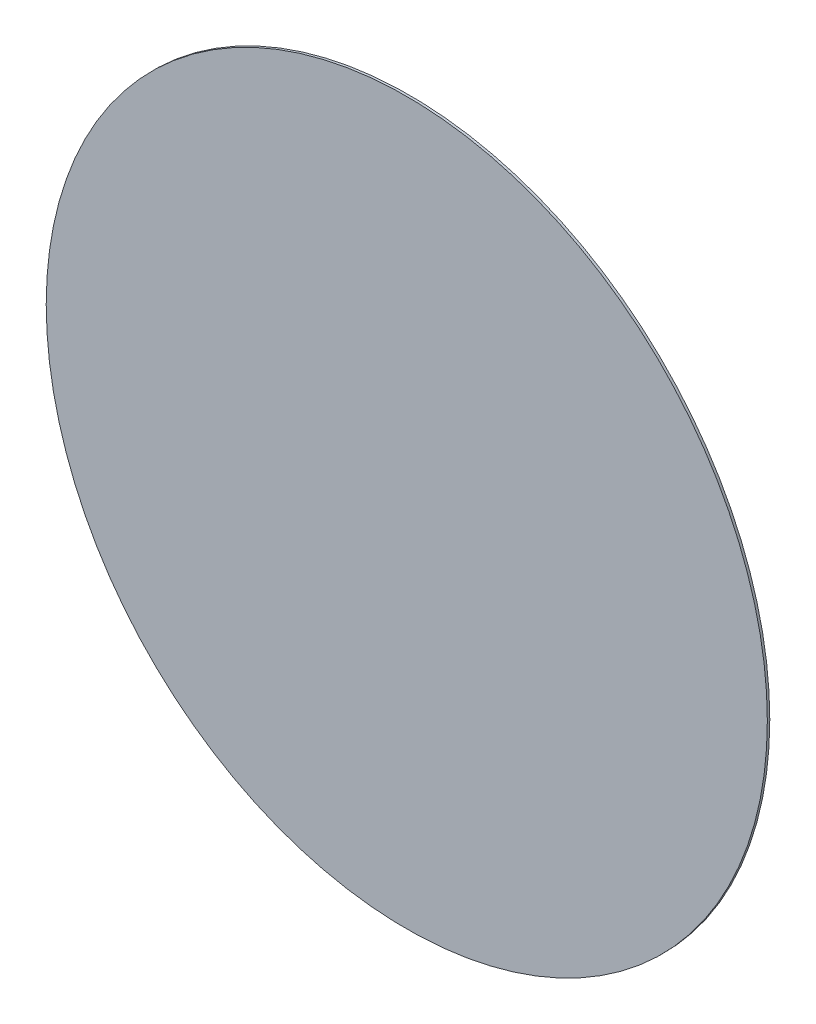
ISO-10303-21;
HEADER;
FILE_DESCRIPTION(('STEP AP214'),'2;1');
FILE_NAME('part.step','',(''),(''),'','','');
FILE_SCHEMA(('AUTOMOTIVE_DESIGN { 1 0 10303 214 1 1 1 1 }'));
ENDSEC;
DATA;
#1=APPLICATION_CONTEXT('core data for automotive mechanical design processes');
#2=APPLICATION_PROTOCOL_DEFINITION('international standard','automotive_design',2000,#1);
#3=PRODUCT_CONTEXT('',#1,'mechanical');
#4=PRODUCT('Part','Part','',(#3));
#5=PRODUCT_RELATED_PRODUCT_CATEGORY('part','',(#4));
#6=PRODUCT_DEFINITION_FORMATION('','',#4);
#7=PRODUCT_DEFINITION_CONTEXT('part definition',#1,'design');
#8=PRODUCT_DEFINITION('design','',#6,#7);
#9=PRODUCT_DEFINITION_SHAPE('','',#8);
#10=(LENGTH_UNIT() NAMED_UNIT(*) SI_UNIT(.MILLI.,.METRE.));
#11=(NAMED_UNIT(*) PLANE_ANGLE_UNIT() SI_UNIT($,.RADIAN.));
#12=(NAMED_UNIT(*) SI_UNIT($,.STERADIAN.) SOLID_ANGLE_UNIT());
#13=UNCERTAINTY_MEASURE_WITH_UNIT(LENGTH_MEASURE(1.E-05),#10,'distance_accuracy_value','');
#14=(GEOMETRIC_REPRESENTATION_CONTEXT(3) GLOBAL_UNCERTAINTY_ASSIGNED_CONTEXT((#13)) GLOBAL_UNIT_ASSIGNED_CONTEXT((#10,
#11,#12)) REPRESENTATION_CONTEXT('',''));
#15=CARTESIAN_POINT('',(0.,0.,0.));
#16=DIRECTION('',(0.,0.,1.));
#17=DIRECTION('',(1.,0.,0.));
#18=AXIS2_PLACEMENT_3D('',#15,#16,#17);
#19=CARTESIAN_POINT('',(-3.719,5.173,11.731));
#20=DIRECTION('',(0.,0.,-1.));
#21=DIRECTION('',(-1.,0.,0.));
#22=AXIS2_PLACEMENT_3D('',#19,#20,#21);
#23=CYLINDRICAL_SURFACE('',#22,1731.719);
#24=CARTESIAN_POINT('',(-3.719,5.173,11.731));
#25=DIRECTION('',(0.,0.,1.));
#26=DIRECTION('',(1.,0.,0.));
#27=AXIS2_PLACEMENT_3D('',#24,#25,#26);
#28=CIRCLE('',#27,1731.719);
#29=CARTESIAN_POINT('',(1728.,5.173,11.731));
#30=VERTEX_POINT('',#29);
#31=EDGE_CURVE('E10',#30,#30,#28,.T.);
#32=ORIENTED_EDGE('',*,*,#31,.F.);
#33=EDGE_LOOP('',(#32));
#34=FACE_BOUND('',#33,.T.);
#35=CARTESIAN_POINT('',(-3.719,5.173,0.));
#36=DIRECTION('',(0.,0.,1.));
#37=DIRECTION('',(1.,0.,0.));
#38=AXIS2_PLACEMENT_3D('',#35,#36,#37);
#39=CIRCLE('',#38,1731.719);
#40=CARTESIAN_POINT('',(1728.,5.173,0.));
#41=VERTEX_POINT('',#40);
#42=EDGE_CURVE('E45',#41,#41,#39,.T.);
#43=ORIENTED_EDGE('',*,*,#42,.T.);
#44=EDGE_LOOP('',(#43));
#45=FACE_BOUND('',#44,.T.);
#46=ADVANCED_FACE('F39',(#34,#45),#23,.T.);
#47=CARTESIAN_POINT('',(-3.719,5.173,11.731));
#48=DIRECTION('',(0.,0.,1.));
#49=DIRECTION('',(1.,0.,0.));
#50=AXIS2_PLACEMENT_3D('',#47,#48,#49);
#51=PLANE('',#50);
#52=ORIENTED_EDGE('',*,*,#31,.T.);
#53=EDGE_LOOP('',(#52));
#54=FACE_BOUND('',#53,.T.);
#55=ADVANCED_FACE('F53',(#54),#51,.T.);
#56=CARTESIAN_POINT('',(-3.719,5.173,0.));
#57=DIRECTION('',(0.,0.,1.));
#58=DIRECTION('',(1.,0.,0.));
#59=AXIS2_PLACEMENT_3D('',#56,#57,#58);
#60=PLANE('',#59);
#61=ORIENTED_EDGE('',*,*,#42,.F.);
#62=EDGE_LOOP('',(#61));
#63=FACE_BOUND('',#62,.T.);
#64=ADVANCED_FACE('F55',(#63),#60,.F.);
#65=CLOSED_SHELL('',(#46,#55,#64));
#66=MANIFOLD_SOLID_BREP('B2',#65);
#67=ADVANCED_BREP_SHAPE_REPRESENTATION('',(#18,#66),#14);
#68=SHAPE_DEFINITION_REPRESENTATION(#9,#67);
ENDSEC;
END-ISO-10303-21;
